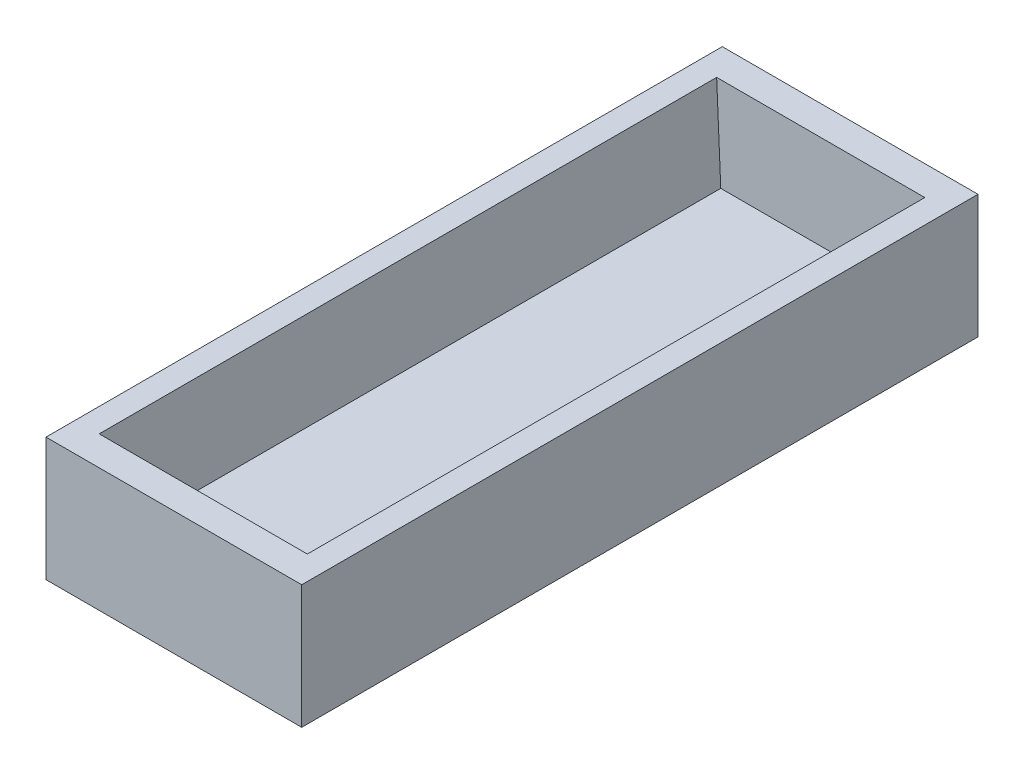
ISO-10303-21;
HEADER;
FILE_DESCRIPTION(('STEP AP214'),'2;1');
FILE_NAME('part.step','',(''),(''),'','','');
FILE_SCHEMA(('AUTOMOTIVE_DESIGN { 1 0 10303 214 1 1 1 1 }'));
ENDSEC;
DATA;
#1=APPLICATION_CONTEXT('core data for automotive mechanical design processes');
#2=APPLICATION_PROTOCOL_DEFINITION('international standard','automotive_design',2000,#1);
#3=PRODUCT_CONTEXT('',#1,'mechanical');
#4=PRODUCT('Part','Part','',(#3));
#5=PRODUCT_RELATED_PRODUCT_CATEGORY('part','',(#4));
#6=PRODUCT_DEFINITION_FORMATION('','',#4);
#7=PRODUCT_DEFINITION_CONTEXT('part definition',#1,'design');
#8=PRODUCT_DEFINITION('design','',#6,#7);
#9=PRODUCT_DEFINITION_SHAPE('','',#8);
#10=(LENGTH_UNIT() NAMED_UNIT(*) SI_UNIT(.MILLI.,.METRE.));
#11=(NAMED_UNIT(*) PLANE_ANGLE_UNIT() SI_UNIT($,.RADIAN.));
#12=(NAMED_UNIT(*) SI_UNIT($,.STERADIAN.) SOLID_ANGLE_UNIT());
#13=UNCERTAINTY_MEASURE_WITH_UNIT(LENGTH_MEASURE(1.E-05),#10,'distance_accuracy_value','');
#14=(GEOMETRIC_REPRESENTATION_CONTEXT(3) GLOBAL_UNCERTAINTY_ASSIGNED_CONTEXT((#13)) GLOBAL_UNIT_ASSIGNED_CONTEXT((#10,
#11,#12)) REPRESENTATION_CONTEXT('',''));
#15=CARTESIAN_POINT('',(0.,0.,0.));
#16=DIRECTION('',(0.,0.,1.));
#17=DIRECTION('',(1.,0.,0.));
#18=AXIS2_PLACEMENT_3D('',#15,#16,#17);
#19=CARTESIAN_POINT('',(224.082614396035,0.,146.05));
#20=DIRECTION('',(0.,1.,0.));
#21=DIRECTION('',(-1.,0.,0.));
#22=AXIS2_PLACEMENT_3D('',#19,#20,#21);
#23=PLANE('',#22);
#24=DIRECTION('',(1.,0.,0.));
#25=VECTOR('',#24,1.);
#26=CARTESIAN_POINT('',(224.082614396035,0.,0.));
#27=LINE('',#26,#25);
#28=CARTESIAN_POINT('',(56.8144035990085,0.,0.));
#29=VERTEX_POINT('',#28);
#30=CARTESIAN_POINT('',(112.041307198017,0.,0.));
#31=VERTEX_POINT('',#30);
#32=EDGE_CURVE('E114',#29,#31,#27,.T.);
#33=ORIENTED_EDGE('',*,*,#32,.T.);
#34=DIRECTION('',(0.,0.,1.));
#35=VECTOR('',#34,1.);
#36=CARTESIAN_POINT('',(112.041307198017,0.,0.));
#37=LINE('',#36,#35);
#38=CARTESIAN_POINT('',(112.041307198017,0.,146.05));
#39=VERTEX_POINT('',#38);
#40=EDGE_CURVE('E104',#31,#39,#37,.T.);
#41=ORIENTED_EDGE('',*,*,#40,.T.);
#42=DIRECTION('',(1.,0.,0.));
#43=VECTOR('',#42,1.);
#44=CARTESIAN_POINT('',(224.082614396035,0.,146.05));
#45=LINE('',#44,#43);
#46=CARTESIAN_POINT('',(56.8144035990085,0.,146.05));
#47=VERTEX_POINT('',#46);
#48=EDGE_CURVE('E112',#47,#39,#45,.T.);
#49=ORIENTED_EDGE('',*,*,#48,.F.);
#50=DIRECTION('',(0.,0.,-1.));
#51=VECTOR('',#50,1.);
#52=CARTESIAN_POINT('',(56.8144035990085,0.,0.));
#53=LINE('',#52,#51);
#54=EDGE_CURVE('E156',#47,#29,#53,.T.);
#55=ORIENTED_EDGE('',*,*,#54,.T.);
#56=EDGE_LOOP('',(#33,#41,#49,#55));
#57=FACE_BOUND('',#56,.T.);
#58=ADVANCED_FACE('F38',(#57),#23,.F.);
#59=CARTESIAN_POINT('',(0.,0.,146.05));
#60=DIRECTION('',(0.,0.,-1.));
#61=DIRECTION('',(-1.,0.,0.));
#62=AXIS2_PLACEMENT_3D('',#59,#60,#61);
#63=PLANE('',#62);
#64=ORIENTED_EDGE('',*,*,#48,.T.);
#65=DIRECTION('',(0.,1.,0.));
#66=VECTOR('',#65,1.);
#67=CARTESIAN_POINT('',(112.041307198017,0.,146.05));
#68=LINE('',#67,#66);
#69=CARTESIAN_POINT('',(112.041307198017,26.67,146.05));
#70=VERTEX_POINT('',#69);
#71=EDGE_CURVE('E101',#39,#70,#68,.T.);
#72=ORIENTED_EDGE('',*,*,#71,.T.);
#73=DIRECTION('',(-1.,0.,0.));
#74=VECTOR('',#73,1.);
#75=CARTESIAN_POINT('',(0.,26.67,146.05));
#76=LINE('',#75,#74);
#77=CARTESIAN_POINT('',(56.8144035990085,26.67,146.05));
#78=VERTEX_POINT('',#77);
#79=EDGE_CURVE('E60',#70,#78,#76,.T.);
#80=ORIENTED_EDGE('',*,*,#79,.T.);
#81=DIRECTION('',(0.,1.,0.));
#82=VECTOR('',#81,1.);
#83=CARTESIAN_POINT('',(56.8144035990085,0.,146.05));
#84=LINE('',#83,#82);
#85=EDGE_CURVE('E117',#47,#78,#84,.T.);
#86=ORIENTED_EDGE('',*,*,#85,.F.);
#87=EDGE_LOOP('',(#64,#72,#80,#86));
#88=FACE_BOUND('',#87,.T.);
#89=ADVANCED_FACE('F116',(#88),#63,.F.);
#90=CARTESIAN_POINT('',(0.,0.,0.));
#91=DIRECTION('',(0.,0.,-1.));
#92=DIRECTION('',(-1.,0.,0.));
#93=AXIS2_PLACEMENT_3D('',#90,#91,#92);
#94=PLANE('',#93);
#95=DIRECTION('',(0.,1.,0.));
#96=VECTOR('',#95,1.);
#97=CARTESIAN_POINT('',(112.041307198017,0.,0.));
#98=LINE('',#97,#96);
#99=CARTESIAN_POINT('',(112.041307198017,26.67,0.));
#100=VERTEX_POINT('',#99);
#101=EDGE_CURVE('E52',#31,#100,#98,.T.);
#102=ORIENTED_EDGE('',*,*,#101,.F.);
#103=ORIENTED_EDGE('',*,*,#32,.F.);
#104=DIRECTION('',(0.,1.,0.));
#105=VECTOR('',#104,1.);
#106=CARTESIAN_POINT('',(56.8144035990085,0.,0.));
#107=LINE('',#106,#105);
#108=CARTESIAN_POINT('',(56.8144035990085,26.67,0.));
#109=VERTEX_POINT('',#108);
#110=EDGE_CURVE('E153',#29,#109,#107,.T.);
#111=ORIENTED_EDGE('',*,*,#110,.T.);
#112=DIRECTION('',(-1.,0.,0.));
#113=VECTOR('',#112,1.);
#114=CARTESIAN_POINT('',(0.,26.67,0.));
#115=LINE('',#114,#113);
#116=EDGE_CURVE('E139',#100,#109,#115,.T.);
#117=ORIENTED_EDGE('',*,*,#116,.F.);
#118=EDGE_LOOP('',(#102,#103,#111,#117));
#119=FACE_BOUND('',#118,.T.);
#120=ADVANCED_FACE('F165',(#119),#94,.T.);
#121=CARTESIAN_POINT('',(62.837855398513,26.67,146.05));
#122=DIRECTION('',(0.,-1.,0.));
#123=DIRECTION('',(0.,0.,-1.));
#124=AXIS2_PLACEMENT_3D('',#121,#122,#123);
#125=PLANE('',#124);
#126=DIRECTION('',(0.,0.,1.));
#127=VECTOR('',#126,1.);
#128=CARTESIAN_POINT('',(61.950665038612,26.67,146.05));
#129=LINE('',#128,#127);
#130=CARTESIAN_POINT('',(61.950665038612,26.67,6.35));
#131=VERTEX_POINT('',#130);
#132=CARTESIAN_POINT('',(61.950665038612,26.67,139.7));
#133=VERTEX_POINT('',#132);
#134=EDGE_CURVE('E147',#131,#133,#129,.T.);
#135=ORIENTED_EDGE('',*,*,#134,.F.);
#136=DIRECTION('',(-1.,0.,0.));
#137=VECTOR('',#136,1.);
#138=CARTESIAN_POINT('',(0.,26.67,6.35));
#139=LINE('',#138,#137);
#140=CARTESIAN_POINT('',(106.905045758414,26.67,6.35));
#141=VERTEX_POINT('',#140);
#142=EDGE_CURVE('E150',#141,#131,#139,.T.);
#143=ORIENTED_EDGE('',*,*,#142,.F.);
#144=DIRECTION('',(0.,0.,-1.));
#145=VECTOR('',#144,1.);
#146=CARTESIAN_POINT('',(106.905045758414,26.67,146.05));
#147=LINE('',#146,#145);
#148=CARTESIAN_POINT('',(106.905045758414,26.67,139.7));
#149=VERTEX_POINT('',#148);
#150=EDGE_CURVE('E144',#149,#141,#147,.T.);
#151=ORIENTED_EDGE('',*,*,#150,.F.);
#152=DIRECTION('',(1.,0.,0.));
#153=VECTOR('',#152,1.);
#154=CARTESIAN_POINT('',(0.,26.67,139.7));
#155=LINE('',#154,#153);
#156=EDGE_CURVE('E141',#133,#149,#155,.T.);
#157=ORIENTED_EDGE('',*,*,#156,.F.);
#158=EDGE_LOOP('',(#135,#143,#151,#157));
#159=FACE_BOUND('',#158,.T.);
#160=ORIENTED_EDGE('',*,*,#79,.F.);
#161=DIRECTION('',(0.,0.,1.));
#162=VECTOR('',#161,1.);
#163=CARTESIAN_POINT('',(112.041307198017,26.67,0.));
#164=LINE('',#163,#162);
#165=EDGE_CURVE('E105',#100,#70,#164,.T.);
#166=ORIENTED_EDGE('',*,*,#165,.F.);
#167=ORIENTED_EDGE('',*,*,#116,.T.);
#168=DIRECTION('',(0.,0.,-1.));
#169=VECTOR('',#168,1.);
#170=CARTESIAN_POINT('',(56.8144035990085,26.67,0.));
#171=LINE('',#170,#169);
#172=EDGE_CURVE('E158',#78,#109,#171,.T.);
#173=ORIENTED_EDGE('',*,*,#172,.F.);
#174=EDGE_LOOP('',(#160,#166,#167,#173));
#175=FACE_BOUND('',#174,.T.);
#176=ADVANCED_FACE('F169',(#159,#175),#125,.F.);
#177=CARTESIAN_POINT('',(62.837855398513,6.35,146.05));
#178=DIRECTION('',(0.,-1.,0.));
#179=DIRECTION('',(0.,0.,-1.));
#180=AXIS2_PLACEMENT_3D('',#177,#178,#179);
#181=PLANE('',#180);
#182=DIRECTION('',(1.,0.,0.));
#183=VECTOR('',#182,1.);
#184=CARTESIAN_POINT('',(62.837855398513,6.35,6.35));
#185=LINE('',#184,#183);
#186=CARTESIAN_POINT('',(62.837855398513,6.35,6.34999999999999));
#187=VERTEX_POINT('',#186);
#188=CARTESIAN_POINT('',(106.017855398513,6.35,6.34999999999999));
#189=VERTEX_POINT('',#188);
#190=EDGE_CURVE('E132',#187,#189,#185,.T.);
#191=ORIENTED_EDGE('',*,*,#190,.F.);
#192=DIRECTION('',(0.,0.,-1.));
#193=VECTOR('',#192,1.);
#194=CARTESIAN_POINT('',(62.837855398513,6.35,146.05));
#195=LINE('',#194,#193);
#196=CARTESIAN_POINT('',(62.837855398513,6.35,139.7));
#197=VERTEX_POINT('',#196);
#198=EDGE_CURVE('E45',#197,#187,#195,.T.);
#199=ORIENTED_EDGE('',*,*,#198,.F.);
#200=DIRECTION('',(1.,0.,0.));
#201=VECTOR('',#200,1.);
#202=CARTESIAN_POINT('',(62.837855398513,6.35,139.7));
#203=LINE('',#202,#201);
#204=CARTESIAN_POINT('',(106.017855398513,6.35,139.7));
#205=VERTEX_POINT('',#204);
#206=EDGE_CURVE('E125',#197,#205,#203,.T.);
#207=ORIENTED_EDGE('',*,*,#206,.T.);
#208=DIRECTION('',(0.,0.,-1.));
#209=VECTOR('',#208,1.);
#210=CARTESIAN_POINT('',(106.017855398513,6.35,146.05));
#211=LINE('',#210,#209);
#212=EDGE_CURVE('E13',#205,#189,#211,.T.);
#213=ORIENTED_EDGE('',*,*,#212,.T.);
#214=EDGE_LOOP('',(#191,#199,#207,#213));
#215=FACE_BOUND('',#214,.T.);
#216=ADVANCED_FACE('F200',(#215),#181,.F.);
#217=CARTESIAN_POINT('',(0.,0.,139.7));
#218=DIRECTION('',(0.,0.,1.));
#219=DIRECTION('',(1.,0.,0.));
#220=AXIS2_PLACEMENT_3D('',#217,#218,#219);
#221=PLANE('',#220);
#222=DIRECTION('',(0.0436193873653362,-0.999048221581858,0.));
#223=VECTOR('',#222,1.);
#224=CARTESIAN_POINT('',(58.4019035990082,107.95,139.7));
#225=LINE('',#224,#223);
#226=EDGE_CURVE('E128',#133,#197,#225,.T.);
#227=ORIENTED_EDGE('',*,*,#226,.F.);
#228=ORIENTED_EDGE('',*,*,#156,.T.);
#229=DIRECTION('',(0.0436193873653286,0.999048221581858,0.));
#230=VECTOR('',#229,1.);
#231=CARTESIAN_POINT('',(106.017855398513,6.35,139.7));
#232=LINE('',#231,#230);
#233=EDGE_CURVE('E120',#205,#149,#232,.T.);
#234=ORIENTED_EDGE('',*,*,#233,.F.);
#235=ORIENTED_EDGE('',*,*,#206,.F.);
#236=EDGE_LOOP('',(#227,#228,#234,#235));
#237=FACE_BOUND('',#236,.T.);
#238=ADVANCED_FACE('F193',(#237),#221,.F.);
#239=CARTESIAN_POINT('',(0.,0.,6.35));
#240=DIRECTION('',(0.,0.,-1.));
#241=DIRECTION('',(1.,0.,0.));
#242=AXIS2_PLACEMENT_3D('',#239,#240,#241);
#243=PLANE('',#242);
#244=DIRECTION('',(0.0436193873653286,0.999048221581858,0.));
#245=VECTOR('',#244,1.);
#246=CARTESIAN_POINT('',(106.017855398513,6.35,6.35));
#247=LINE('',#246,#245);
#248=EDGE_CURVE('E135',#189,#141,#247,.T.);
#249=ORIENTED_EDGE('',*,*,#248,.T.);
#250=ORIENTED_EDGE('',*,*,#142,.T.);
#251=DIRECTION('',(0.0436193873653362,-0.999048221581858,0.));
#252=VECTOR('',#251,1.);
#253=CARTESIAN_POINT('',(58.4019035990082,107.95,6.35));
#254=LINE('',#253,#252);
#255=EDGE_CURVE('E130',#131,#187,#254,.T.);
#256=ORIENTED_EDGE('',*,*,#255,.T.);
#257=ORIENTED_EDGE('',*,*,#190,.T.);
#258=EDGE_LOOP('',(#249,#250,#256,#257));
#259=FACE_BOUND('',#258,.T.);
#260=ADVANCED_FACE('F198',(#259),#243,.F.);
#261=CARTESIAN_POINT('',(58.4019035990082,107.95,146.05));
#262=DIRECTION('',(-0.999048221581858,-0.0436193873653363,0.));
#263=DIRECTION('',(0.0436193873653363,-0.999048221581858,0.));
#264=AXIS2_PLACEMENT_3D('',#261,#262,#263);
#265=PLANE('',#264);
#266=ORIENTED_EDGE('',*,*,#255,.F.);
#267=ORIENTED_EDGE('',*,*,#134,.T.);
#268=ORIENTED_EDGE('',*,*,#226,.T.);
#269=ORIENTED_EDGE('',*,*,#198,.T.);
#270=EDGE_LOOP('',(#266,#267,#268,#269));
#271=FACE_BOUND('',#270,.T.);
#272=ADVANCED_FACE('F179',(#271),#265,.F.);
#273=CARTESIAN_POINT('',(106.017855398513,6.35,146.05));
#274=DIRECTION('',(0.999048221581858,-0.0436193873653286,0.));
#275=DIRECTION('',(0.0436193873653286,0.999048221581858,0.));
#276=AXIS2_PLACEMENT_3D('',#273,#274,#275);
#277=PLANE('',#276);
#278=ORIENTED_EDGE('',*,*,#233,.T.);
#279=ORIENTED_EDGE('',*,*,#150,.T.);
#280=ORIENTED_EDGE('',*,*,#248,.F.);
#281=ORIENTED_EDGE('',*,*,#212,.F.);
#282=EDGE_LOOP('',(#278,#279,#280,#281));
#283=FACE_BOUND('',#282,.T.);
#284=ADVANCED_FACE('F172',(#283),#277,.F.);
#285=CARTESIAN_POINT('',(56.8144035990085,0.,0.));
#286=DIRECTION('',(1.,0.,0.));
#287=DIRECTION('',(0.,0.,-1.));
#288=AXIS2_PLACEMENT_3D('',#285,#286,#287);
#289=PLANE('',#288);
#290=ORIENTED_EDGE('',*,*,#172,.T.);
#291=ORIENTED_EDGE('',*,*,#110,.F.);
#292=ORIENTED_EDGE('',*,*,#54,.F.);
#293=ORIENTED_EDGE('',*,*,#85,.T.);
#294=EDGE_LOOP('',(#290,#291,#292,#293));
#295=FACE_BOUND('',#294,.T.);
#296=ADVANCED_FACE('F170',(#295),#289,.F.);
#297=CARTESIAN_POINT('',(112.041307198017,0.,0.));
#298=DIRECTION('',(-1.,0.,0.));
#299=DIRECTION('',(0.,0.,1.));
#300=AXIS2_PLACEMENT_3D('',#297,#298,#299);
#301=PLANE('',#300);
#302=ORIENTED_EDGE('',*,*,#165,.T.);
#303=ORIENTED_EDGE('',*,*,#71,.F.);
#304=ORIENTED_EDGE('',*,*,#40,.F.);
#305=ORIENTED_EDGE('',*,*,#101,.T.);
#306=EDGE_LOOP('',(#302,#303,#304,#305));
#307=FACE_BOUND('',#306,.T.);
#308=ADVANCED_FACE('F103',(#307),#301,.F.);
#309=CLOSED_SHELL('',(#58,#89,#120,#176,#216,#238,#260,#272,#284,#296,#308));
#310=MANIFOLD_SOLID_BREP('B2',#309);
#311=ADVANCED_BREP_SHAPE_REPRESENTATION('',(#18,#310),#14);
#312=SHAPE_DEFINITION_REPRESENTATION(#9,#311);
ENDSEC;
END-ISO-10303-21;
